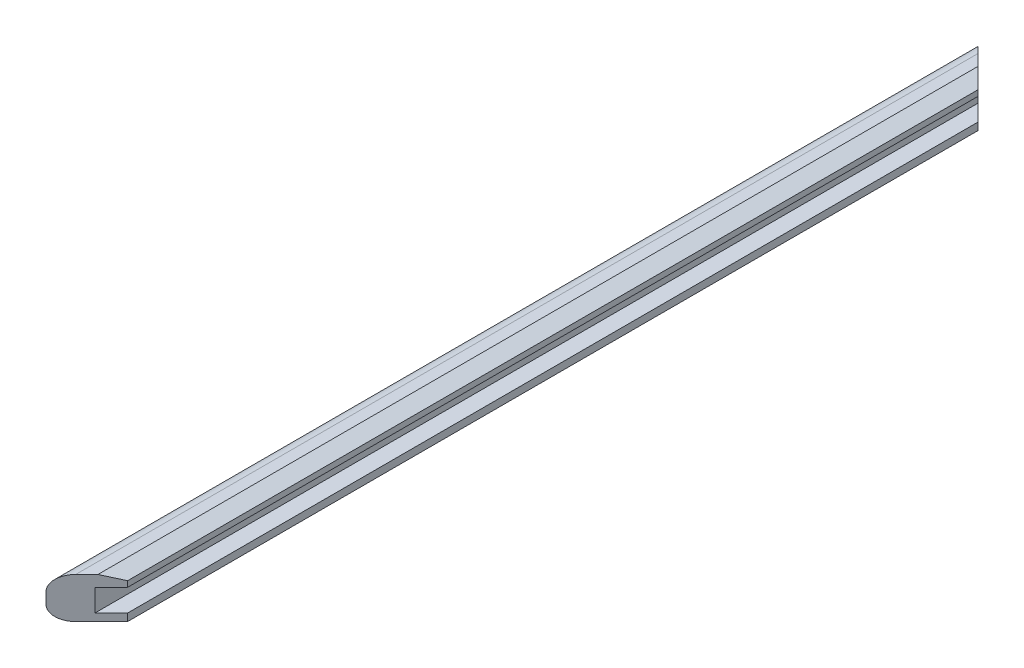
ISO-10303-21;
HEADER;
FILE_DESCRIPTION(('STEP AP214'),'2;1');
FILE_NAME('part.step','',(''),(''),'','','');
FILE_SCHEMA(('AUTOMOTIVE_DESIGN { 1 0 10303 214 1 1 1 1 }'));
ENDSEC;
DATA;
#1=APPLICATION_CONTEXT('core data for automotive mechanical design processes');
#2=APPLICATION_PROTOCOL_DEFINITION('international standard','automotive_design',2000,#1);
#3=PRODUCT_CONTEXT('',#1,'mechanical');
#4=PRODUCT('Part','Part','',(#3));
#5=PRODUCT_RELATED_PRODUCT_CATEGORY('part','',(#4));
#6=PRODUCT_DEFINITION_FORMATION('','',#4);
#7=PRODUCT_DEFINITION_CONTEXT('part definition',#1,'design');
#8=PRODUCT_DEFINITION('design','',#6,#7);
#9=PRODUCT_DEFINITION_SHAPE('','',#8);
#10=(LENGTH_UNIT() NAMED_UNIT(*) SI_UNIT(.MILLI.,.METRE.));
#11=(NAMED_UNIT(*) PLANE_ANGLE_UNIT() SI_UNIT($,.RADIAN.));
#12=(NAMED_UNIT(*) SI_UNIT($,.STERADIAN.) SOLID_ANGLE_UNIT());
#13=UNCERTAINTY_MEASURE_WITH_UNIT(LENGTH_MEASURE(1.E-05),#10,'distance_accuracy_value','');
#14=(GEOMETRIC_REPRESENTATION_CONTEXT(3) GLOBAL_UNCERTAINTY_ASSIGNED_CONTEXT((#13)) GLOBAL_UNIT_ASSIGNED_CONTEXT((#10,
#11,#12)) REPRESENTATION_CONTEXT('',''));
#15=CARTESIAN_POINT('',(0.,0.,0.));
#16=DIRECTION('',(0.,0.,1.));
#17=DIRECTION('',(1.,0.,0.));
#18=AXIS2_PLACEMENT_3D('',#15,#16,#17);
#19=CARTESIAN_POINT('',(17.4625,-17.4625,-1320.8));
#20=DIRECTION('',(1.,0.,0.));
#21=DIRECTION('',(0.,0.,-1.));
#22=AXIS2_PLACEMENT_3D('',#19,#20,#21);
#23=PLANE('',#22);
#24=DIRECTION('',(0.,1.,0.));
#25=VECTOR('',#24,1.);
#26=CARTESIAN_POINT('',(17.4625,-17.4625,-762.635));
#27=LINE('',#26,#25);
#28=CARTESIAN_POINT('',(17.4625,-17.4625,-762.635));
#29=VERTEX_POINT('',#28);
#30=CARTESIAN_POINT('',(17.4625,-11.1125,-762.635));
#31=VERTEX_POINT('',#30);
#32=EDGE_CURVE('E117',#29,#31,#27,.T.);
#33=ORIENTED_EDGE('',*,*,#32,.T.);
#34=DIRECTION('',(0.,0.,1.));
#35=VECTOR('',#34,1.);
#36=CARTESIAN_POINT('',(17.4625,-11.1125,-1320.8));
#37=LINE('',#36,#35);
#38=CARTESIAN_POINT('',(17.4625,-11.1125,-34.9249999999996));
#39=VERTEX_POINT('',#38);
#40=EDGE_CURVE('E152',#31,#39,#37,.T.);
#41=ORIENTED_EDGE('',*,*,#40,.T.);
#42=DIRECTION('',(0.,1.,0.));
#43=VECTOR('',#42,1.);
#44=CARTESIAN_POINT('',(17.4625,-17.4625,-34.9249999999996));
#45=LINE('',#44,#43);
#46=CARTESIAN_POINT('',(17.4625,-17.4625,-34.9249999999996));
#47=VERTEX_POINT('',#46);
#48=EDGE_CURVE('E143',#47,#39,#45,.T.);
#49=ORIENTED_EDGE('',*,*,#48,.F.);
#50=DIRECTION('',(0.,0.,1.));
#51=VECTOR('',#50,1.);
#52=CARTESIAN_POINT('',(17.4625,-17.4625,-1320.8));
#53=LINE('',#52,#51);
#54=EDGE_CURVE('E134',#29,#47,#53,.T.);
#55=ORIENTED_EDGE('',*,*,#54,.F.);
#56=EDGE_LOOP('',(#33,#41,#49,#55));
#57=FACE_BOUND('',#56,.T.);
#58=ADVANCED_FACE('F34',(#57),#23,.T.);
#59=CARTESIAN_POINT('',(17.4625,7.93749999999999,-762.635));
#60=VERTEX_POINT('',#59);
#61=CARTESIAN_POINT('',(17.4625,12.8400780248193,-762.635));
#62=VERTEX_POINT('',#61);
#63=EDGE_CURVE('E128',#60,#62,#27,.T.);
#64=ORIENTED_EDGE('',*,*,#63,.T.);
#65=DIRECTION('',(0.,0.,1.));
#66=VECTOR('',#65,1.);
#67=CARTESIAN_POINT('',(17.4625,12.8400780248192,-1320.8));
#68=LINE('',#67,#66);
#69=CARTESIAN_POINT('',(17.4625,12.8400780248192,-34.9249999999996));
#70=VERTEX_POINT('',#69);
#71=EDGE_CURVE('E57',#62,#70,#68,.T.);
#72=ORIENTED_EDGE('',*,*,#71,.T.);
#73=CARTESIAN_POINT('',(17.4625,7.93749999999999,-34.9249999999996));
#74=VERTEX_POINT('',#73);
#75=EDGE_CURVE('E174',#74,#70,#45,.T.);
#76=ORIENTED_EDGE('',*,*,#75,.F.);
#77=DIRECTION('',(0.,0.,1.));
#78=VECTOR('',#77,1.);
#79=CARTESIAN_POINT('',(17.4625,7.93749999999999,-1320.8));
#80=LINE('',#79,#78);
#81=EDGE_CURVE('E185',#60,#74,#80,.T.);
#82=ORIENTED_EDGE('',*,*,#81,.F.);
#83=EDGE_LOOP('',(#64,#72,#76,#82));
#84=FACE_BOUND('',#83,.T.);
#85=ADVANCED_FACE('F184',(#84),#23,.T.);
#86=CARTESIAN_POINT('',(-17.4625,-17.4625,-1320.8));
#87=DIRECTION('',(0.,-1.,0.));
#88=DIRECTION('',(0.,0.,-1.));
#89=AXIS2_PLACEMENT_3D('',#86,#87,#88);
#90=PLANE('',#89);
#91=DIRECTION('',(0.707106781186551,0.,0.707106781186544));
#92=VECTOR('',#91,1.);
#93=CARTESIAN_POINT('',(-17.4625,-17.4625,-797.56));
#94=LINE('',#93,#92);
#95=CARTESIAN_POINT('',(-4.76250000000002,-17.4625,-784.86));
#96=VERTEX_POINT('',#95);
#97=EDGE_CURVE('E120',#96,#29,#94,.T.);
#98=ORIENTED_EDGE('',*,*,#97,.T.);
#99=ORIENTED_EDGE('',*,*,#54,.T.);
#100=DIRECTION('',(-0.707106781186551,0.,0.707106781186544));
#101=VECTOR('',#100,1.);
#102=CARTESIAN_POINT('',(-17.4625,-17.4625,0.));
#103=LINE('',#102,#101);
#104=CARTESIAN_POINT('',(-4.76249999999998,-17.4625,-12.6999999999999));
#105=VERTEX_POINT('',#104);
#106=EDGE_CURVE('E180',#47,#105,#103,.T.);
#107=ORIENTED_EDGE('',*,*,#106,.T.);
#108=DIRECTION('',(0.,0.,1.));
#109=VECTOR('',#108,1.);
#110=CARTESIAN_POINT('',(-4.7625,-17.4625,-1320.8));
#111=LINE('',#110,#109);
#112=EDGE_CURVE('E137',#105,#96,#111,.F.);
#113=ORIENTED_EDGE('',*,*,#112,.T.);
#114=EDGE_LOOP('',(#98,#99,#107,#113));
#115=FACE_BOUND('',#114,.T.);
#116=ADVANCED_FACE('F132',(#115),#90,.T.);
#117=CARTESIAN_POINT('',(-17.4625,-17.4625,-1320.8));
#118=DIRECTION('',(-1.,0.,0.));
#119=DIRECTION('',(0.,0.,1.));
#120=AXIS2_PLACEMENT_3D('',#117,#118,#119);
#121=PLANE('',#120);
#122=DIRECTION('',(0.,1.,0.));
#123=VECTOR('',#122,1.);
#124=CARTESIAN_POINT('',(-17.4625,-17.4625,-797.56));
#125=LINE('',#124,#123);
#126=CARTESIAN_POINT('',(-17.4625,-4.7625,-797.56));
#127=VERTEX_POINT('',#126);
#128=CARTESIAN_POINT('',(-17.4625,4.76249999999999,-797.56));
#129=VERTEX_POINT('',#128);
#130=EDGE_CURVE('E139',#127,#129,#125,.T.);
#131=ORIENTED_EDGE('',*,*,#130,.F.);
#132=DIRECTION('',(0.,0.,1.));
#133=VECTOR('',#132,1.);
#134=CARTESIAN_POINT('',(-17.4625,-4.7625,-1320.8));
#135=LINE('',#134,#133);
#136=CARTESIAN_POINT('',(-17.4625,-4.7625,0.));
#137=VERTEX_POINT('',#136);
#138=EDGE_CURVE('E148',#127,#137,#135,.T.);
#139=ORIENTED_EDGE('',*,*,#138,.T.);
#140=DIRECTION('',(0.,-1.,0.));
#141=VECTOR('',#140,1.);
#142=CARTESIAN_POINT('',(-17.4625,-17.4625,0.));
#143=LINE('',#142,#141);
#144=CARTESIAN_POINT('',(-17.4625,4.76249999999999,0.));
#145=VERTEX_POINT('',#144);
#146=EDGE_CURVE('E145',#145,#137,#143,.T.);
#147=ORIENTED_EDGE('',*,*,#146,.F.);
#148=DIRECTION('',(0.,0.,1.));
#149=VECTOR('',#148,1.);
#150=CARTESIAN_POINT('',(-17.4625,4.76249999999999,-1320.8));
#151=LINE('',#150,#149);
#152=EDGE_CURVE('E144',#145,#129,#151,.F.);
#153=ORIENTED_EDGE('',*,*,#152,.T.);
#154=EDGE_LOOP('',(#131,#139,#147,#153));
#155=FACE_BOUND('',#154,.T.);
#156=ADVANCED_FACE('F244',(#155),#121,.T.);
#157=CARTESIAN_POINT('',(-17.4625,17.4625,-1320.8));
#158=DIRECTION('',(0.,1.,0.));
#159=DIRECTION('',(0.,0.,1.));
#160=AXIS2_PLACEMENT_3D('',#157,#158,#159);
#161=PLANE('',#160);
#162=DIRECTION('',(0.707106781186551,0.,0.707106781186544));
#163=VECTOR('',#162,1.);
#164=CARTESIAN_POINT('',(-17.4625,17.4625,-797.56));
#165=LINE('',#164,#163);
#166=CARTESIAN_POINT('',(-4.76250000000002,17.4625,-784.86));
#167=VERTEX_POINT('',#166);
#168=CARTESIAN_POINT('',(4.76249999999983,17.4625,-775.335));
#169=VERTEX_POINT('',#168);
#170=EDGE_CURVE('E49',#167,#169,#165,.T.);
#171=ORIENTED_EDGE('',*,*,#170,.F.);
#172=DIRECTION('',(0.,0.,1.));
#173=VECTOR('',#172,1.);
#174=CARTESIAN_POINT('',(-4.7625,17.4625,-1320.8));
#175=LINE('',#174,#173);
#176=CARTESIAN_POINT('',(-4.76249999999998,17.4625,-12.6999999999999));
#177=VERTEX_POINT('',#176);
#178=EDGE_CURVE('E159',#167,#177,#175,.T.);
#179=ORIENTED_EDGE('',*,*,#178,.T.);
#180=DIRECTION('',(-0.707106781186551,0.,0.707106781186544));
#181=VECTOR('',#180,1.);
#182=CARTESIAN_POINT('',(-17.4625,17.4625,0.));
#183=LINE('',#182,#181);
#184=CARTESIAN_POINT('',(4.76249999999984,17.4625,-22.2249999999997));
#185=VERTEX_POINT('',#184);
#186=EDGE_CURVE('E171',#185,#177,#183,.T.);
#187=ORIENTED_EDGE('',*,*,#186,.F.);
#188=DIRECTION('',(0.,0.,-1.));
#189=VECTOR('',#188,1.);
#190=CARTESIAN_POINT('',(4.76249999999983,17.4625,-1320.8));
#191=LINE('',#190,#189);
#192=EDGE_CURVE('E163',#185,#169,#191,.T.);
#193=ORIENTED_EDGE('',*,*,#192,.T.);
#194=EDGE_LOOP('',(#171,#179,#187,#193));
#195=FACE_BOUND('',#194,.T.);
#196=ADVANCED_FACE('F178',(#195),#161,.T.);
#197=CARTESIAN_POINT('',(17.4625,-11.1125,-1320.8));
#198=DIRECTION('',(0.,-1.,0.));
#199=DIRECTION('',(1.,0.,0.));
#200=AXIS2_PLACEMENT_3D('',#197,#198,#199);
#201=PLANE('',#200);
#202=ORIENTED_EDGE('',*,*,#40,.F.);
#203=DIRECTION('',(-0.707106781186551,0.,-0.707106781186544));
#204=VECTOR('',#203,1.);
#205=CARTESIAN_POINT('',(-261.62,-11.1125000000001,-1041.7175));
#206=LINE('',#205,#204);
#207=CARTESIAN_POINT('',(3.49249999999999,-11.1125,-776.605));
#208=VERTEX_POINT('',#207);
#209=EDGE_CURVE('E123',#31,#208,#206,.T.);
#210=ORIENTED_EDGE('',*,*,#209,.T.);
#211=DIRECTION('',(0.,0.,1.));
#212=VECTOR('',#211,1.);
#213=CARTESIAN_POINT('',(3.49249999999999,-11.1125,-1320.8));
#214=LINE('',#213,#212);
#215=CARTESIAN_POINT('',(3.49249999999999,-11.1125,-20.9549999999998));
#216=VERTEX_POINT('',#215);
#217=EDGE_CURVE('E221',#208,#216,#214,.T.);
#218=ORIENTED_EDGE('',*,*,#217,.T.);
#219=DIRECTION('',(0.707106781186551,0.,-0.707106781186544));
#220=VECTOR('',#219,1.);
#221=CARTESIAN_POINT('',(660.4,-11.1124999999998,-677.862499999993));
#222=LINE('',#221,#220);
#223=EDGE_CURVE('E215',#216,#39,#222,.T.);
#224=ORIENTED_EDGE('',*,*,#223,.T.);
#225=EDGE_LOOP('',(#202,#210,#218,#224));
#226=FACE_BOUND('',#225,.T.);
#227=ADVANCED_FACE('F236',(#226),#201,.F.);
#228=CARTESIAN_POINT('',(3.49249999999999,7.93749999999999,-1320.8));
#229=DIRECTION('',(-1.,0.,0.));
#230=DIRECTION('',(0.,-1.,0.));
#231=AXIS2_PLACEMENT_3D('',#228,#229,#230);
#232=PLANE('',#231);
#233=ORIENTED_EDGE('',*,*,#217,.F.);
#234=DIRECTION('',(0.,1.,0.));
#235=VECTOR('',#234,1.);
#236=CARTESIAN_POINT('',(3.49249999999999,7.93750000000004,-776.605));
#237=LINE('',#236,#235);
#238=CARTESIAN_POINT('',(3.49250000000001,7.93749999999999,-776.605));
#239=VERTEX_POINT('',#238);
#240=EDGE_CURVE('E195',#208,#239,#237,.T.);
#241=ORIENTED_EDGE('',*,*,#240,.T.);
#242=DIRECTION('',(0.,0.,1.));
#243=VECTOR('',#242,1.);
#244=CARTESIAN_POINT('',(3.49249999999999,7.93749999999999,-1320.8));
#245=LINE('',#244,#243);
#246=CARTESIAN_POINT('',(3.49250000000001,7.93749999999999,-20.9549999999995));
#247=VERTEX_POINT('',#246);
#248=EDGE_CURVE('E224',#239,#247,#245,.T.);
#249=ORIENTED_EDGE('',*,*,#248,.T.);
#250=DIRECTION('',(0.,-1.,0.));
#251=VECTOR('',#250,1.);
#252=CARTESIAN_POINT('',(3.49249999999999,7.93749999999987,-20.9549999999998));
#253=LINE('',#252,#251);
#254=EDGE_CURVE('E211',#247,#216,#253,.T.);
#255=ORIENTED_EDGE('',*,*,#254,.T.);
#256=EDGE_LOOP('',(#233,#241,#249,#255));
#257=FACE_BOUND('',#256,.T.);
#258=ADVANCED_FACE('F234',(#257),#232,.F.);
#259=CARTESIAN_POINT('',(17.4625,7.93749999999999,-1320.8));
#260=DIRECTION('',(0.,1.,0.));
#261=DIRECTION('',(0.,0.,1.));
#262=AXIS2_PLACEMENT_3D('',#259,#260,#261);
#263=PLANE('',#262);
#264=ORIENTED_EDGE('',*,*,#248,.F.);
#265=DIRECTION('',(0.707106781186551,0.,0.707106781186544));
#266=VECTOR('',#265,1.);
#267=CARTESIAN_POINT('',(-261.62,7.93749999999999,-1041.7175));
#268=LINE('',#267,#266);
#269=EDGE_CURVE('E193',#239,#60,#268,.T.);
#270=ORIENTED_EDGE('',*,*,#269,.T.);
#271=ORIENTED_EDGE('',*,*,#81,.T.);
#272=DIRECTION('',(-0.707106781186551,0.,0.707106781186544));
#273=VECTOR('',#272,1.);
#274=CARTESIAN_POINT('',(660.4,7.93749999999999,-677.862499999993));
#275=LINE('',#274,#273);
#276=EDGE_CURVE('E208',#74,#247,#275,.T.);
#277=ORIENTED_EDGE('',*,*,#276,.T.);
#278=EDGE_LOOP('',(#264,#270,#271,#277));
#279=FACE_BOUND('',#278,.T.);
#280=ADVANCED_FACE('F230',(#279),#263,.F.);
#281=CARTESIAN_POINT('',(-4.7625,-4.7625,-1320.8));
#282=DIRECTION('',(0.,0.,1.));
#283=DIRECTION('',(1.,0.,0.));
#284=AXIS2_PLACEMENT_3D('',#281,#282,#283);
#285=CYLINDRICAL_SURFACE('',#284,12.7);
#286=CARTESIAN_POINT('',(-4.7625,-4.7625,-784.86));
#287=DIRECTION('',(-0.707106781186544,0.,0.707106781186551));
#288=DIRECTION('',(0.707106781186551,0.,0.707106781186544));
#289=AXIS2_PLACEMENT_3D('',#286,#287,#288);
#290=ELLIPSE('',#289,17.9605122421382,12.7);
#291=EDGE_CURVE('E191',#96,#127,#290,.F.);
#292=ORIENTED_EDGE('',*,*,#291,.F.);
#293=ORIENTED_EDGE('',*,*,#112,.F.);
#294=CARTESIAN_POINT('',(-4.7625,-4.7625,-12.6999999999999));
#295=DIRECTION('',(-0.707106781186544,0.,-0.707106781186551));
#296=DIRECTION('',(-0.707106781186551,0.,0.707106781186544));
#297=AXIS2_PLACEMENT_3D('',#294,#295,#296);
#298=ELLIPSE('',#297,17.9605122421382,12.7);
#299=EDGE_CURVE('E206',#137,#105,#298,.F.);
#300=ORIENTED_EDGE('',*,*,#299,.F.);
#301=ORIENTED_EDGE('',*,*,#138,.F.);
#302=EDGE_LOOP('',(#292,#293,#300,#301));
#303=FACE_BOUND('',#302,.T.);
#304=ADVANCED_FACE('F239',(#303),#285,.T.);
#305=CARTESIAN_POINT('',(-4.7625,4.76249999999999,-1320.8));
#306=DIRECTION('',(0.,0.,1.));
#307=DIRECTION('',(1.,0.,0.));
#308=AXIS2_PLACEMENT_3D('',#305,#306,#307);
#309=CYLINDRICAL_SURFACE('',#308,12.7);
#310=CARTESIAN_POINT('',(-4.7625,4.76249999999999,-784.86));
#311=DIRECTION('',(-0.707106781186544,0.,0.707106781186551));
#312=DIRECTION('',(0.707106781186551,0.,0.707106781186544));
#313=AXIS2_PLACEMENT_3D('',#310,#311,#312);
#314=ELLIPSE('',#313,17.9605122421382,12.7);
#315=EDGE_CURVE('E127',#129,#167,#314,.F.);
#316=ORIENTED_EDGE('',*,*,#315,.F.);
#317=ORIENTED_EDGE('',*,*,#152,.F.);
#318=CARTESIAN_POINT('',(-4.7625,4.76249999999999,-12.6999999999999));
#319=DIRECTION('',(-0.707106781186544,0.,-0.707106781186551));
#320=DIRECTION('',(-0.707106781186551,0.,0.707106781186544));
#321=AXIS2_PLACEMENT_3D('',#318,#319,#320);
#322=ELLIPSE('',#321,17.9605122421382,12.7);
#323=EDGE_CURVE('E204',#177,#145,#322,.F.);
#324=ORIENTED_EDGE('',*,*,#323,.F.);
#325=ORIENTED_EDGE('',*,*,#178,.F.);
#326=EDGE_LOOP('',(#316,#317,#324,#325));
#327=FACE_BOUND('',#326,.T.);
#328=ADVANCED_FACE('F248',(#327),#309,.T.);
#329=CARTESIAN_POINT('',(17.4625,12.8400780248192,-1320.8));
#330=DIRECTION('',(-0.342020143325664,-0.93969262078591,0.));
#331=DIRECTION('',(0.,0.,1.));
#332=AXIS2_PLACEMENT_3D('',#329,#330,#331);
#333=PLANE('',#332);
#334=DIRECTION('',(-0.68479107877174,0.249243569363952,-0.684791078771733));
#335=VECTOR('',#334,1.);
#336=CARTESIAN_POINT('',(-244.282737339028,108.107553377167,-1024.38023733903));
#337=LINE('',#336,#335);
#338=EDGE_CURVE('E11',#169,#62,#337,.F.);
#339=ORIENTED_EDGE('',*,*,#338,.F.);
#340=ORIENTED_EDGE('',*,*,#192,.F.);
#341=DIRECTION('',(0.68479107877174,-0.249243569363952,-0.684791078771733));
#342=VECTOR('',#341,1.);
#343=CARTESIAN_POINT('',(620.459207180355,-206.63277474936,-637.921707180349));
#344=LINE('',#343,#342);
#345=EDGE_CURVE('E43',#70,#185,#344,.F.);
#346=ORIENTED_EDGE('',*,*,#345,.F.);
#347=ORIENTED_EDGE('',*,*,#71,.F.);
#348=EDGE_LOOP('',(#339,#340,#346,#347));
#349=FACE_BOUND('',#348,.T.);
#350=ADVANCED_FACE('F36',(#349),#333,.F.);
#351=CARTESIAN_POINT('',(-17.4625,-17.4625,0.));
#352=DIRECTION('',(-0.707106781186544,0.,-0.707106781186551));
#353=DIRECTION('',(-0.707106781186551,0.,0.707106781186544));
#354=AXIS2_PLACEMENT_3D('',#351,#352,#353);
#355=PLANE('',#354);
#356=ORIENTED_EDGE('',*,*,#254,.F.);
#357=ORIENTED_EDGE('',*,*,#276,.F.);
#358=ORIENTED_EDGE('',*,*,#75,.T.);
#359=ORIENTED_EDGE('',*,*,#345,.T.);
#360=ORIENTED_EDGE('',*,*,#186,.T.);
#361=ORIENTED_EDGE('',*,*,#323,.T.);
#362=ORIENTED_EDGE('',*,*,#146,.T.);
#363=ORIENTED_EDGE('',*,*,#299,.T.);
#364=ORIENTED_EDGE('',*,*,#106,.F.);
#365=ORIENTED_EDGE('',*,*,#48,.T.);
#366=ORIENTED_EDGE('',*,*,#223,.F.);
#367=EDGE_LOOP('',(#356,#357,#358,#359,#360,#361,#362,#363,#364,#365,#366));
#368=FACE_BOUND('',#367,.T.);
#369=ADVANCED_FACE('F170',(#368),#355,.F.);
#370=CARTESIAN_POINT('',(-17.4625,-17.4625,-797.56));
#371=DIRECTION('',(-0.707106781186544,0.,0.707106781186551));
#372=DIRECTION('',(0.707106781186551,0.,0.707106781186544));
#373=AXIS2_PLACEMENT_3D('',#370,#371,#372);
#374=PLANE('',#373);
#375=ORIENTED_EDGE('',*,*,#32,.F.);
#376=ORIENTED_EDGE('',*,*,#97,.F.);
#377=ORIENTED_EDGE('',*,*,#291,.T.);
#378=ORIENTED_EDGE('',*,*,#130,.T.);
#379=ORIENTED_EDGE('',*,*,#315,.T.);
#380=ORIENTED_EDGE('',*,*,#170,.T.);
#381=ORIENTED_EDGE('',*,*,#338,.T.);
#382=ORIENTED_EDGE('',*,*,#63,.F.);
#383=ORIENTED_EDGE('',*,*,#269,.F.);
#384=ORIENTED_EDGE('',*,*,#240,.F.);
#385=ORIENTED_EDGE('',*,*,#209,.F.);
#386=EDGE_LOOP('',(#375,#376,#377,#378,#379,#380,#381,#382,#383,#384,#385));
#387=FACE_BOUND('',#386,.T.);
#388=ADVANCED_FACE('F119',(#387),#374,.F.);
#389=CLOSED_SHELL('',(#58,#85,#116,#156,#196,#227,#258,#280,#304,#328,#350,#369,#388));
#390=MANIFOLD_SOLID_BREP('B2',#389);
#391=ADVANCED_BREP_SHAPE_REPRESENTATION('',(#18,#390),#14);
#392=SHAPE_DEFINITION_REPRESENTATION(#9,#391);
ENDSEC;
END-ISO-10303-21;
